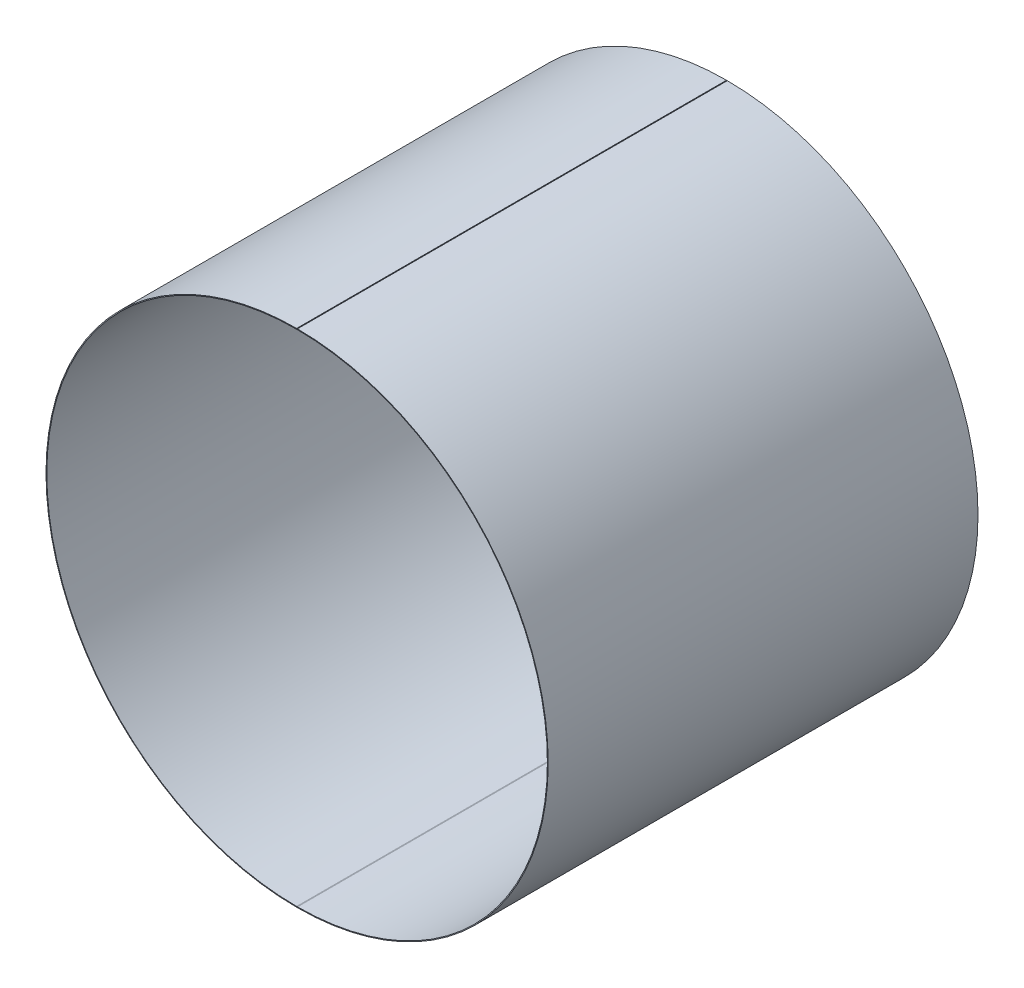
ISO-10303-21;
HEADER;
FILE_DESCRIPTION(('STEP AP214'),'2;1');
FILE_NAME('part.step','',(''),(''),'','','');
FILE_SCHEMA(('AUTOMOTIVE_DESIGN { 1 0 10303 214 1 1 1 1 }'));
ENDSEC;
DATA;
#1=APPLICATION_CONTEXT('core data for automotive mechanical design processes');
#2=APPLICATION_PROTOCOL_DEFINITION('international standard','automotive_design',2000,#1);
#3=PRODUCT_CONTEXT('',#1,'mechanical');
#4=PRODUCT('Part','Part','',(#3));
#5=PRODUCT_RELATED_PRODUCT_CATEGORY('part','',(#4));
#6=PRODUCT_DEFINITION_FORMATION('','',#4);
#7=PRODUCT_DEFINITION_CONTEXT('part definition',#1,'design');
#8=PRODUCT_DEFINITION('design','',#6,#7);
#9=PRODUCT_DEFINITION_SHAPE('','',#8);
#10=(LENGTH_UNIT() NAMED_UNIT(*) SI_UNIT(.MILLI.,.METRE.));
#11=(NAMED_UNIT(*) PLANE_ANGLE_UNIT() SI_UNIT($,.RADIAN.));
#12=(NAMED_UNIT(*) SI_UNIT($,.STERADIAN.) SOLID_ANGLE_UNIT());
#13=UNCERTAINTY_MEASURE_WITH_UNIT(LENGTH_MEASURE(1.E-05),#10,'distance_accuracy_value','');
#14=(GEOMETRIC_REPRESENTATION_CONTEXT(3) GLOBAL_UNCERTAINTY_ASSIGNED_CONTEXT((#13)) GLOBAL_UNIT_ASSIGNED_CONTEXT((#10,
#11,#12)) REPRESENTATION_CONTEXT('',''));
#15=CARTESIAN_POINT('',(0.,0.,0.));
#16=DIRECTION('',(0.,0.,1.));
#17=DIRECTION('',(1.,0.,0.));
#18=AXIS2_PLACEMENT_3D('',#15,#16,#17);
#19=CARTESIAN_POINT('',(0.254,-159.258,273.05));
#20=DIRECTION('',(0.,0.,1.));
#21=DIRECTION('',(1.,0.,0.));
#22=AXIS2_PLACEMENT_3D('',#19,#20,#21);
#23=PLANE('',#22);
#24=DIRECTION('',(0.,1.,0.));
#25=VECTOR('',#24,1.);
#26=CARTESIAN_POINT('',(0.254,-159.258,273.05));
#27=LINE('',#26,#25);
#28=CARTESIAN_POINT('',(0.254,-159.258,273.05));
#29=VERTEX_POINT('',#28);
#30=CARTESIAN_POINT('',(0.254,-158.75,273.05));
#31=VERTEX_POINT('',#30);
#32=EDGE_CURVE('E11',#29,#31,#27,.T.);
#33=ORIENTED_EDGE('',*,*,#32,.F.);
#34=CARTESIAN_POINT('',(0.254000000000029,0.,273.05));
#35=DIRECTION('',(0.,0.,1.));
#36=DIRECTION('',(1.,0.,0.));
#37=AXIS2_PLACEMENT_3D('',#34,#35,#36);
#38=CIRCLE('',#37,159.258);
#39=CARTESIAN_POINT('',(0.254000000000039,159.258,273.05));
#40=VERTEX_POINT('',#39);
#41=EDGE_CURVE('E130',#40,#29,#38,.F.);
#42=ORIENTED_EDGE('',*,*,#41,.F.);
#43=DIRECTION('',(0.,1.,0.));
#44=VECTOR('',#43,1.);
#45=CARTESIAN_POINT('',(0.254000000000039,158.75,273.05));
#46=LINE('',#45,#44);
#47=CARTESIAN_POINT('',(0.254000000000039,158.75,273.05));
#48=VERTEX_POINT('',#47);
#49=EDGE_CURVE('E112',#48,#40,#46,.T.);
#50=ORIENTED_EDGE('',*,*,#49,.F.);
#51=CARTESIAN_POINT('',(0.254000000000029,0.,273.05));
#52=DIRECTION('',(0.,0.,-1.));
#53=DIRECTION('',(1.,0.,0.));
#54=AXIS2_PLACEMENT_3D('',#51,#52,#53);
#55=CIRCLE('',#54,158.75);
#56=EDGE_CURVE('E121',#48,#31,#55,.T.);
#57=ORIENTED_EDGE('',*,*,#56,.T.);
#58=EDGE_LOOP('',(#33,#42,#50,#57));
#59=FACE_BOUND('',#58,.T.);
#60=ADVANCED_FACE('F36',(#59),#23,.T.);
#61=CARTESIAN_POINT('',(0.254,-158.75,0.));
#62=DIRECTION('',(0.,0.,-1.));
#63=DIRECTION('',(-1.,0.,0.));
#64=AXIS2_PLACEMENT_3D('',#61,#62,#63);
#65=PLANE('',#64);
#66=DIRECTION('',(0.,-1.,0.));
#67=VECTOR('',#66,1.);
#68=CARTESIAN_POINT('',(0.254,-158.75,0.));
#69=LINE('',#68,#67);
#70=CARTESIAN_POINT('',(0.254,-158.75,0.));
#71=VERTEX_POINT('',#70);
#72=CARTESIAN_POINT('',(0.254,-159.258,0.));
#73=VERTEX_POINT('',#72);
#74=EDGE_CURVE('E44',#71,#73,#69,.T.);
#75=ORIENTED_EDGE('',*,*,#74,.F.);
#76=CARTESIAN_POINT('',(0.254000000000029,0.,0.));
#77=DIRECTION('',(0.,0.,-1.));
#78=DIRECTION('',(1.,0.,0.));
#79=AXIS2_PLACEMENT_3D('',#76,#77,#78);
#80=CIRCLE('',#79,158.75);
#81=CARTESIAN_POINT('',(0.254000000000039,158.75,0.));
#82=VERTEX_POINT('',#81);
#83=EDGE_CURVE('E152',#82,#71,#80,.T.);
#84=ORIENTED_EDGE('',*,*,#83,.F.);
#85=DIRECTION('',(0.,1.,0.));
#86=VECTOR('',#85,1.);
#87=CARTESIAN_POINT('',(0.254000000000039,158.75,0.));
#88=LINE('',#87,#86);
#89=CARTESIAN_POINT('',(0.254000000000039,159.258,0.));
#90=VERTEX_POINT('',#89);
#91=EDGE_CURVE('E114',#82,#90,#88,.T.);
#92=ORIENTED_EDGE('',*,*,#91,.T.);
#93=CARTESIAN_POINT('',(0.254000000000029,0.,0.));
#94=DIRECTION('',(0.,0.,1.));
#95=DIRECTION('',(1.,0.,0.));
#96=AXIS2_PLACEMENT_3D('',#93,#94,#95);
#97=CIRCLE('',#96,159.258);
#98=EDGE_CURVE('E149',#90,#73,#97,.F.);
#99=ORIENTED_EDGE('',*,*,#98,.T.);
#100=EDGE_LOOP('',(#75,#84,#92,#99));
#101=FACE_BOUND('',#100,.T.);
#102=ADVANCED_FACE('F183',(#101),#65,.T.);
#103=CARTESIAN_POINT('',(-0.253999999999971,-158.75,273.05));
#104=DIRECTION('',(0.,0.,1.));
#105=DIRECTION('',(1.,0.,0.));
#106=AXIS2_PLACEMENT_3D('',#103,#104,#105);
#107=PLANE('',#106);
#108=DIRECTION('',(-1.72021053351044E-13,-1.,0.));
#109=VECTOR('',#108,1.);
#110=CARTESIAN_POINT('',(-0.253999999999971,-158.75,273.05));
#111=LINE('',#110,#109);
#112=CARTESIAN_POINT('',(-0.253999999999971,-158.75,273.05));
#113=VERTEX_POINT('',#112);
#114=CARTESIAN_POINT('',(-0.254000000000058,-159.258,273.05));
#115=VERTEX_POINT('',#114);
#116=EDGE_CURVE('E52',#113,#115,#111,.T.);
#117=ORIENTED_EDGE('',*,*,#116,.F.);
#118=CARTESIAN_POINT('',(-0.254000000000029,0.,273.05));
#119=DIRECTION('',(0.,0.,-1.));
#120=DIRECTION('',(-1.,0.,0.));
#121=AXIS2_PLACEMENT_3D('',#118,#119,#120);
#122=CIRCLE('',#121,158.75);
#123=CARTESIAN_POINT('',(-0.254000000000039,158.75,273.05));
#124=VERTEX_POINT('',#123);
#125=EDGE_CURVE('E92',#113,#124,#122,.T.);
#126=ORIENTED_EDGE('',*,*,#125,.T.);
#127=DIRECTION('',(0.,-1.,0.));
#128=VECTOR('',#127,1.);
#129=CARTESIAN_POINT('',(-0.254000000000055,159.258,273.05));
#130=LINE('',#129,#128);
#131=CARTESIAN_POINT('',(-0.254000000000055,159.258,273.05));
#132=VERTEX_POINT('',#131);
#133=EDGE_CURVE('E191',#132,#124,#130,.T.);
#134=ORIENTED_EDGE('',*,*,#133,.F.);
#135=CARTESIAN_POINT('',(-0.254000000000029,0.,273.05));
#136=DIRECTION('',(0.,0.,1.));
#137=DIRECTION('',(1.,0.,0.));
#138=AXIS2_PLACEMENT_3D('',#135,#136,#137);
#139=CIRCLE('',#138,159.258);
#140=EDGE_CURVE('E189',#115,#132,#139,.F.);
#141=ORIENTED_EDGE('',*,*,#140,.F.);
#142=EDGE_LOOP('',(#117,#126,#134,#141));
#143=FACE_BOUND('',#142,.T.);
#144=ADVANCED_FACE('F199',(#143),#107,.T.);
#145=CARTESIAN_POINT('',(-0.254000000000058,-159.258,0.));
#146=DIRECTION('',(0.,0.,-1.));
#147=DIRECTION('',(-1.,0.,0.));
#148=AXIS2_PLACEMENT_3D('',#145,#146,#147);
#149=PLANE('',#148);
#150=DIRECTION('',(1.72021053351044E-13,1.,0.));
#151=VECTOR('',#150,1.);
#152=CARTESIAN_POINT('',(-0.254000000000058,-159.258,0.));
#153=LINE('',#152,#151);
#154=CARTESIAN_POINT('',(-0.254000000000058,-159.258,0.));
#155=VERTEX_POINT('',#154);
#156=CARTESIAN_POINT('',(-0.253999999999971,-158.75,0.));
#157=VERTEX_POINT('',#156);
#158=EDGE_CURVE('E86',#155,#157,#153,.T.);
#159=ORIENTED_EDGE('',*,*,#158,.F.);
#160=CARTESIAN_POINT('',(-0.254000000000029,0.,0.));
#161=DIRECTION('',(0.,0.,1.));
#162=DIRECTION('',(1.,0.,0.));
#163=AXIS2_PLACEMENT_3D('',#160,#161,#162);
#164=CIRCLE('',#163,159.258);
#165=CARTESIAN_POINT('',(-0.254000000000055,159.258,0.));
#166=VERTEX_POINT('',#165);
#167=EDGE_CURVE('E144',#155,#166,#164,.F.);
#168=ORIENTED_EDGE('',*,*,#167,.T.);
#169=DIRECTION('',(0.,-1.,0.));
#170=VECTOR('',#169,1.);
#171=CARTESIAN_POINT('',(-0.254000000000055,159.258,0.));
#172=LINE('',#171,#170);
#173=CARTESIAN_POINT('',(-0.254000000000039,158.75,0.));
#174=VERTEX_POINT('',#173);
#175=EDGE_CURVE('E141',#166,#174,#172,.T.);
#176=ORIENTED_EDGE('',*,*,#175,.T.);
#177=CARTESIAN_POINT('',(-0.254000000000029,0.,0.));
#178=DIRECTION('',(0.,0.,-1.));
#179=DIRECTION('',(-1.,0.,0.));
#180=AXIS2_PLACEMENT_3D('',#177,#178,#179);
#181=CIRCLE('',#180,158.75);
#182=EDGE_CURVE('E138',#157,#174,#181,.T.);
#183=ORIENTED_EDGE('',*,*,#182,.F.);
#184=EDGE_LOOP('',(#159,#168,#176,#183));
#185=FACE_BOUND('',#184,.T.);
#186=ADVANCED_FACE('F203',(#185),#149,.T.);
#187=CARTESIAN_POINT('',(-0.254000000000029,0.,273.05));
#188=DIRECTION('',(0.,0.,-1.));
#189=DIRECTION('',(-1.,0.,0.));
#190=AXIS2_PLACEMENT_3D('',#187,#188,#189);
#191=CYLINDRICAL_SURFACE('',#190,158.75);
#192=ORIENTED_EDGE('',*,*,#182,.T.);
#193=DIRECTION('',(0.,0.,-1.));
#194=VECTOR('',#193,1.);
#195=CARTESIAN_POINT('',(-0.254000000000039,158.75,273.05));
#196=LINE('',#195,#194);
#197=EDGE_CURVE('E168',#124,#174,#196,.T.);
#198=ORIENTED_EDGE('',*,*,#197,.F.);
#199=ORIENTED_EDGE('',*,*,#125,.F.);
#200=DIRECTION('',(0.,0.,-1.));
#201=VECTOR('',#200,1.);
#202=CARTESIAN_POINT('',(-0.253999999999971,-158.75,273.05));
#203=LINE('',#202,#201);
#204=EDGE_CURVE('E137',#113,#157,#203,.T.);
#205=ORIENTED_EDGE('',*,*,#204,.T.);
#206=EDGE_LOOP('',(#192,#198,#199,#205));
#207=FACE_BOUND('',#206,.T.);
#208=ADVANCED_FACE('F206',(#207),#191,.F.);
#209=CARTESIAN_POINT('',(-0.254000000000055,159.258,273.05));
#210=DIRECTION('',(1.,0.,0.));
#211=DIRECTION('',(0.,1.,0.));
#212=AXIS2_PLACEMENT_3D('',#209,#210,#211);
#213=PLANE('',#212);
#214=ORIENTED_EDGE('',*,*,#175,.F.);
#215=DIRECTION('',(0.,0.,-1.));
#216=VECTOR('',#215,1.);
#217=CARTESIAN_POINT('',(-0.254000000000055,159.258,273.05));
#218=LINE('',#217,#216);
#219=EDGE_CURVE('E166',#132,#166,#218,.T.);
#220=ORIENTED_EDGE('',*,*,#219,.F.);
#221=ORIENTED_EDGE('',*,*,#133,.T.);
#222=ORIENTED_EDGE('',*,*,#197,.T.);
#223=EDGE_LOOP('',(#214,#220,#221,#222));
#224=FACE_BOUND('',#223,.T.);
#225=ADVANCED_FACE('F198',(#224),#213,.T.);
#226=CARTESIAN_POINT('',(-0.254000000000029,0.,273.05));
#227=DIRECTION('',(0.,0.,-1.));
#228=DIRECTION('',(-1.,0.,0.));
#229=AXIS2_PLACEMENT_3D('',#226,#227,#228);
#230=CYLINDRICAL_SURFACE('',#229,159.258);
#231=ORIENTED_EDGE('',*,*,#167,.F.);
#232=DIRECTION('',(0.,0.,-1.));
#233=VECTOR('',#232,1.);
#234=CARTESIAN_POINT('',(-0.254000000000058,-159.258,273.05));
#235=LINE('',#234,#233);
#236=EDGE_CURVE('E163',#115,#155,#235,.T.);
#237=ORIENTED_EDGE('',*,*,#236,.F.);
#238=ORIENTED_EDGE('',*,*,#140,.T.);
#239=ORIENTED_EDGE('',*,*,#219,.T.);
#240=EDGE_LOOP('',(#231,#237,#238,#239));
#241=FACE_BOUND('',#240,.T.);
#242=ADVANCED_FACE('F201',(#241),#230,.T.);
#243=CARTESIAN_POINT('',(-0.253999999999971,-159.258,273.05));
#244=DIRECTION('',(0.,-1.,0.));
#245=DIRECTION('',(0.,0.,-1.));
#246=AXIS2_PLACEMENT_3D('',#243,#244,#245);
#247=PLANE('',#246);
#248=DIRECTION('',(1.,0.,0.));
#249=VECTOR('',#248,1.);
#250=CARTESIAN_POINT('',(-0.253999999999971,-159.258,0.));
#251=LINE('',#250,#249);
#252=EDGE_CURVE('E147',#73,#155,#251,.F.);
#253=ORIENTED_EDGE('',*,*,#252,.F.);
#254=DIRECTION('',(0.,0.,-1.));
#255=VECTOR('',#254,1.);
#256=CARTESIAN_POINT('',(0.254,-159.258,273.05));
#257=LINE('',#256,#255);
#258=EDGE_CURVE('E160',#29,#73,#257,.T.);
#259=ORIENTED_EDGE('',*,*,#258,.F.);
#260=DIRECTION('',(1.,0.,0.));
#261=VECTOR('',#260,1.);
#262=CARTESIAN_POINT('',(-0.253999999999971,-159.258,273.05));
#263=LINE('',#262,#261);
#264=EDGE_CURVE('E132',#29,#115,#263,.F.);
#265=ORIENTED_EDGE('',*,*,#264,.T.);
#266=ORIENTED_EDGE('',*,*,#236,.T.);
#267=EDGE_LOOP('',(#253,#259,#265,#266));
#268=FACE_BOUND('',#267,.T.);
#269=ADVANCED_FACE('F180',(#268),#247,.T.);
#270=CARTESIAN_POINT('',(0.254000000000029,0.,273.05));
#271=DIRECTION('',(0.,0.,-1.));
#272=DIRECTION('',(-1.,0.,0.));
#273=AXIS2_PLACEMENT_3D('',#270,#271,#272);
#274=CYLINDRICAL_SURFACE('',#273,159.258);
#275=ORIENTED_EDGE('',*,*,#98,.F.);
#276=DIRECTION('',(0.,0.,-1.));
#277=VECTOR('',#276,1.);
#278=CARTESIAN_POINT('',(0.254000000000039,159.258,273.05));
#279=LINE('',#278,#277);
#280=EDGE_CURVE('E116',#40,#90,#279,.T.);
#281=ORIENTED_EDGE('',*,*,#280,.F.);
#282=ORIENTED_EDGE('',*,*,#41,.T.);
#283=ORIENTED_EDGE('',*,*,#258,.T.);
#284=EDGE_LOOP('',(#275,#281,#282,#283));
#285=FACE_BOUND('',#284,.T.);
#286=ADVANCED_FACE('F176',(#285),#274,.T.);
#287=CARTESIAN_POINT('',(0.254000000000039,158.75,273.05));
#288=DIRECTION('',(-1.,0.,0.));
#289=DIRECTION('',(0.,-1.,0.));
#290=AXIS2_PLACEMENT_3D('',#287,#288,#289);
#291=PLANE('',#290);
#292=ORIENTED_EDGE('',*,*,#91,.F.);
#293=DIRECTION('',(0.,0.,-1.));
#294=VECTOR('',#293,1.);
#295=CARTESIAN_POINT('',(0.254000000000039,158.75,273.05));
#296=LINE('',#295,#294);
#297=EDGE_CURVE('E108',#48,#82,#296,.T.);
#298=ORIENTED_EDGE('',*,*,#297,.F.);
#299=ORIENTED_EDGE('',*,*,#49,.T.);
#300=ORIENTED_EDGE('',*,*,#280,.T.);
#301=EDGE_LOOP('',(#292,#298,#299,#300));
#302=FACE_BOUND('',#301,.T.);
#303=ADVANCED_FACE('F110',(#302),#291,.T.);
#304=CARTESIAN_POINT('',(0.254000000000029,0.,273.05));
#305=DIRECTION('',(0.,0.,-1.));
#306=DIRECTION('',(-1.,0.,0.));
#307=AXIS2_PLACEMENT_3D('',#304,#305,#306);
#308=CYLINDRICAL_SURFACE('',#307,158.75);
#309=ORIENTED_EDGE('',*,*,#83,.T.);
#310=DIRECTION('',(0.,0.,-1.));
#311=VECTOR('',#310,1.);
#312=CARTESIAN_POINT('',(0.254,-158.75,273.05));
#313=LINE('',#312,#311);
#314=EDGE_CURVE('E117',#31,#71,#313,.T.);
#315=ORIENTED_EDGE('',*,*,#314,.F.);
#316=ORIENTED_EDGE('',*,*,#56,.F.);
#317=ORIENTED_EDGE('',*,*,#297,.T.);
#318=EDGE_LOOP('',(#309,#315,#316,#317));
#319=FACE_BOUND('',#318,.T.);
#320=ADVANCED_FACE('F122',(#319),#308,.F.);
#321=CARTESIAN_POINT('',(-0.253999999999971,-158.75,273.05));
#322=DIRECTION('',(0.,-1.,0.));
#323=DIRECTION('',(0.,0.,-1.));
#324=AXIS2_PLACEMENT_3D('',#321,#322,#323);
#325=PLANE('',#324);
#326=DIRECTION('',(-1.,0.,0.));
#327=VECTOR('',#326,1.);
#328=CARTESIAN_POINT('',(-0.253999999999971,-158.75,0.));
#329=LINE('',#328,#327);
#330=EDGE_CURVE('E154',#71,#157,#329,.T.);
#331=ORIENTED_EDGE('',*,*,#330,.T.);
#332=ORIENTED_EDGE('',*,*,#204,.F.);
#333=DIRECTION('',(-1.,0.,0.));
#334=VECTOR('',#333,1.);
#335=CARTESIAN_POINT('',(-0.253999999999971,-158.75,273.05));
#336=LINE('',#335,#334);
#337=EDGE_CURVE('E126',#31,#113,#336,.T.);
#338=ORIENTED_EDGE('',*,*,#337,.F.);
#339=ORIENTED_EDGE('',*,*,#314,.T.);
#340=EDGE_LOOP('',(#331,#332,#338,#339));
#341=FACE_BOUND('',#340,.T.);
#342=ADVANCED_FACE('F185',(#341),#325,.F.);
#343=CARTESIAN_POINT('',(-0.254000000000029,0.,273.05));
#344=DIRECTION('',(0.,0.,-1.));
#345=DIRECTION('',(-1.,0.,0.));
#346=AXIS2_PLACEMENT_3D('',#343,#344,#345);
#347=PLANE('',#346);
#348=ORIENTED_EDGE('',*,*,#337,.T.);
#349=ORIENTED_EDGE('',*,*,#116,.T.);
#350=ORIENTED_EDGE('',*,*,#264,.F.);
#351=ORIENTED_EDGE('',*,*,#32,.T.);
#352=EDGE_LOOP('',(#348,#349,#350,#351));
#353=FACE_BOUND('',#352,.T.);
#354=ADVANCED_FACE('F188',(#353),#347,.F.);
#355=CARTESIAN_POINT('',(-0.254000000000029,0.,0.));
#356=DIRECTION('',(0.,0.,-1.));
#357=DIRECTION('',(-1.,0.,0.));
#358=AXIS2_PLACEMENT_3D('',#355,#356,#357);
#359=PLANE('',#358);
#360=ORIENTED_EDGE('',*,*,#252,.T.);
#361=ORIENTED_EDGE('',*,*,#158,.T.);
#362=ORIENTED_EDGE('',*,*,#330,.F.);
#363=ORIENTED_EDGE('',*,*,#74,.T.);
#364=EDGE_LOOP('',(#360,#361,#362,#363));
#365=FACE_BOUND('',#364,.T.);
#366=ADVANCED_FACE('F171',(#365),#359,.T.);
#367=CLOSED_SHELL('',(#60,#102,#144,#186,#208,#225,#242,#269,#286,#303,#320,#342,#354,#366));
#368=MANIFOLD_SOLID_BREP('B2',#367);
#369=ADVANCED_BREP_SHAPE_REPRESENTATION('',(#18,#368),#14);
#370=SHAPE_DEFINITION_REPRESENTATION(#9,#369);
ENDSEC;
END-ISO-10303-21;
